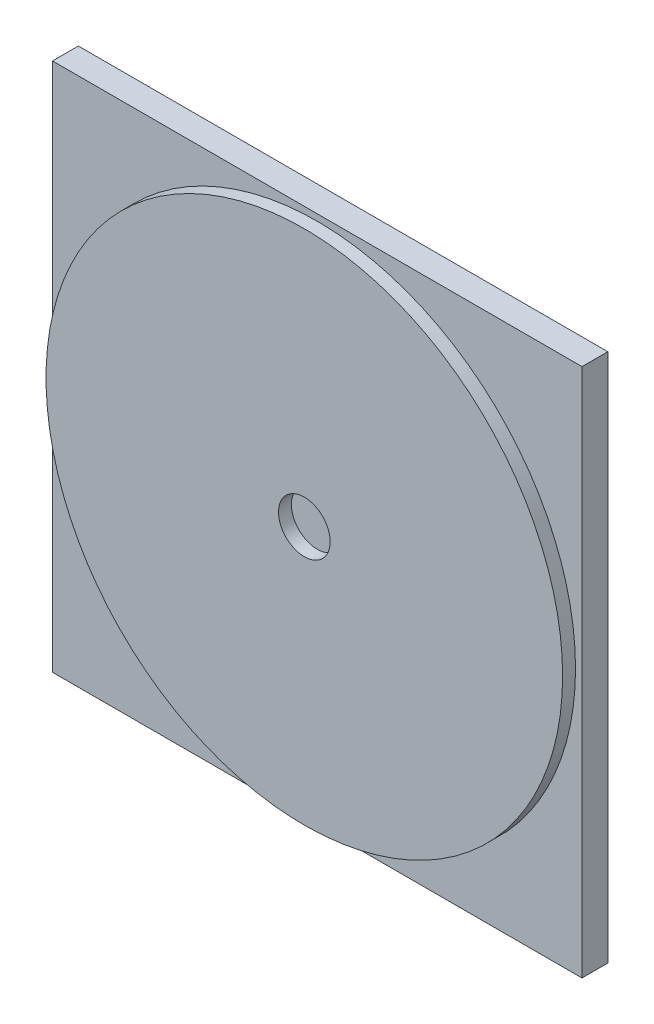
ISO-10303-21;
HEADER;
FILE_DESCRIPTION(('STEP AP214'),'2;1');
FILE_NAME('part.step','',(''),(''),'','','');
FILE_SCHEMA(('AUTOMOTIVE_DESIGN { 1 0 10303 214 1 1 1 1 }'));
ENDSEC;
DATA;
#1=APPLICATION_CONTEXT('core data for automotive mechanical design processes');
#2=APPLICATION_PROTOCOL_DEFINITION('international standard','automotive_design',2000,#1);
#3=PRODUCT_CONTEXT('',#1,'mechanical');
#4=PRODUCT('Part','Part','',(#3));
#5=PRODUCT_RELATED_PRODUCT_CATEGORY('part','',(#4));
#6=PRODUCT_DEFINITION_FORMATION('','',#4);
#7=PRODUCT_DEFINITION_CONTEXT('part definition',#1,'design');
#8=PRODUCT_DEFINITION('design','',#6,#7);
#9=PRODUCT_DEFINITION_SHAPE('','',#8);
#10=(LENGTH_UNIT() NAMED_UNIT(*) SI_UNIT(.MILLI.,.METRE.));
#11=(NAMED_UNIT(*) PLANE_ANGLE_UNIT() SI_UNIT($,.RADIAN.));
#12=(NAMED_UNIT(*) SI_UNIT($,.STERADIAN.) SOLID_ANGLE_UNIT());
#13=UNCERTAINTY_MEASURE_WITH_UNIT(LENGTH_MEASURE(1.E-05),#10,'distance_accuracy_value','');
#14=(GEOMETRIC_REPRESENTATION_CONTEXT(3) GLOBAL_UNCERTAINTY_ASSIGNED_CONTEXT((#13)) GLOBAL_UNIT_ASSIGNED_CONTEXT((#10,
#11,#12)) REPRESENTATION_CONTEXT('',''));
#15=CARTESIAN_POINT('',(0.,0.,0.));
#16=DIRECTION('',(0.,0.,1.));
#17=DIRECTION('',(1.,0.,0.));
#18=AXIS2_PLACEMENT_3D('',#15,#16,#17);
#19=CARTESIAN_POINT('',(-22.0558035714286,11.8973214285714,2.));
#20=DIRECTION('',(1.,0.,0.));
#21=DIRECTION('',(0.,0.,-1.));
#22=AXIS2_PLACEMENT_3D('',#19,#20,#21);
#23=PLANE('',#22);
#24=DIRECTION('',(0.,-1.,0.));
#25=VECTOR('',#24,1.);
#26=CARTESIAN_POINT('',(-22.0558035714286,11.8973214285714,0.));
#27=LINE('',#26,#25);
#28=CARTESIAN_POINT('',(-22.0558035714286,11.8973214285714,0.));
#29=VERTEX_POINT('',#28);
#30=CARTESIAN_POINT('',(-22.0558035714286,-29.1026785714286,0.));
#31=VERTEX_POINT('',#30);
#32=EDGE_CURVE('E99',#29,#31,#27,.T.);
#33=ORIENTED_EDGE('',*,*,#32,.T.);
#34=DIRECTION('',(0.,0.,-1.));
#35=VECTOR('',#34,1.);
#36=CARTESIAN_POINT('',(-22.0558035714286,-29.1026785714286,2.));
#37=LINE('',#36,#35);
#38=CARTESIAN_POINT('',(-22.0558035714286,-29.1026785714286,2.));
#39=VERTEX_POINT('',#38);
#40=EDGE_CURVE('E36',#39,#31,#37,.T.);
#41=ORIENTED_EDGE('',*,*,#40,.F.);
#42=DIRECTION('',(0.,-1.,0.));
#43=VECTOR('',#42,1.);
#44=CARTESIAN_POINT('',(-22.0558035714286,11.8973214285714,2.));
#45=LINE('',#44,#43);
#46=CARTESIAN_POINT('',(-22.0558035714286,11.8973214285714,2.));
#47=VERTEX_POINT('',#46);
#48=EDGE_CURVE('E86',#47,#39,#45,.T.);
#49=ORIENTED_EDGE('',*,*,#48,.F.);
#50=DIRECTION('',(0.,0.,-1.));
#51=VECTOR('',#50,1.);
#52=CARTESIAN_POINT('',(-22.0558035714286,11.8973214285714,2.));
#53=LINE('',#52,#51);
#54=EDGE_CURVE('E95',#47,#29,#53,.T.);
#55=ORIENTED_EDGE('',*,*,#54,.T.);
#56=EDGE_LOOP('',(#33,#41,#49,#55));
#57=FACE_BOUND('',#56,.T.);
#58=ADVANCED_FACE('F33',(#57),#23,.F.);
#59=CARTESIAN_POINT('',(-22.0558035714286,-29.1026785714286,2.));
#60=DIRECTION('',(0.,1.,0.));
#61=DIRECTION('',(0.,0.,1.));
#62=AXIS2_PLACEMENT_3D('',#59,#60,#61);
#63=PLANE('',#62);
#64=DIRECTION('',(1.,0.,0.));
#65=VECTOR('',#64,1.);
#66=CARTESIAN_POINT('',(-22.0558035714286,-29.1026785714286,0.));
#67=LINE('',#66,#65);
#68=CARTESIAN_POINT('',(18.9441964285714,-29.1026785714286,0.));
#69=VERTEX_POINT('',#68);
#70=EDGE_CURVE('E91',#31,#69,#67,.T.);
#71=ORIENTED_EDGE('',*,*,#70,.T.);
#72=DIRECTION('',(0.,0.,-1.));
#73=VECTOR('',#72,1.);
#74=CARTESIAN_POINT('',(18.9441964285714,-29.1026785714286,2.));
#75=LINE('',#74,#73);
#76=CARTESIAN_POINT('',(18.9441964285714,-29.1026785714286,2.));
#77=VERTEX_POINT('',#76);
#78=EDGE_CURVE('E89',#77,#69,#75,.T.);
#79=ORIENTED_EDGE('',*,*,#78,.F.);
#80=DIRECTION('',(1.,0.,0.));
#81=VECTOR('',#80,1.);
#82=CARTESIAN_POINT('',(-22.0558035714286,-29.1026785714286,2.));
#83=LINE('',#82,#81);
#84=EDGE_CURVE('E81',#39,#77,#83,.T.);
#85=ORIENTED_EDGE('',*,*,#84,.F.);
#86=ORIENTED_EDGE('',*,*,#40,.T.);
#87=EDGE_LOOP('',(#71,#79,#85,#86));
#88=FACE_BOUND('',#87,.T.);
#89=ADVANCED_FACE('F90',(#88),#63,.F.);
#90=CARTESIAN_POINT('',(18.9441964285714,11.8973214285714,2.));
#91=DIRECTION('',(-1.,0.,0.));
#92=DIRECTION('',(0.,-1.,0.));
#93=AXIS2_PLACEMENT_3D('',#90,#91,#92);
#94=PLANE('',#93);
#95=DIRECTION('',(0.,1.,0.));
#96=VECTOR('',#95,1.);
#97=CARTESIAN_POINT('',(18.9441964285714,11.8973214285714,0.));
#98=LINE('',#97,#96);
#99=CARTESIAN_POINT('',(18.9441964285714,11.8973214285714,0.));
#100=VERTEX_POINT('',#99);
#101=EDGE_CURVE('E67',#69,#100,#98,.T.);
#102=ORIENTED_EDGE('',*,*,#101,.T.);
#103=DIRECTION('',(0.,0.,-1.));
#104=VECTOR('',#103,1.);
#105=CARTESIAN_POINT('',(18.9441964285714,11.8973214285714,2.));
#106=LINE('',#105,#104);
#107=CARTESIAN_POINT('',(18.9441964285714,11.8973214285714,2.));
#108=VERTEX_POINT('',#107);
#109=EDGE_CURVE('E92',#108,#100,#106,.T.);
#110=ORIENTED_EDGE('',*,*,#109,.F.);
#111=DIRECTION('',(0.,1.,0.));
#112=VECTOR('',#111,1.);
#113=CARTESIAN_POINT('',(18.9441964285714,11.8973214285714,2.));
#114=LINE('',#113,#112);
#115=EDGE_CURVE('E84',#77,#108,#114,.T.);
#116=ORIENTED_EDGE('',*,*,#115,.F.);
#117=ORIENTED_EDGE('',*,*,#78,.T.);
#118=EDGE_LOOP('',(#102,#110,#116,#117));
#119=FACE_BOUND('',#118,.T.);
#120=ADVANCED_FACE('F93',(#119),#94,.F.);
#121=CARTESIAN_POINT('',(-22.0558035714286,11.8973214285714,2.));
#122=DIRECTION('',(0.,-1.,0.));
#123=DIRECTION('',(0.,0.,-1.));
#124=AXIS2_PLACEMENT_3D('',#121,#122,#123);
#125=PLANE('',#124);
#126=DIRECTION('',(-1.,0.,0.));
#127=VECTOR('',#126,1.);
#128=CARTESIAN_POINT('',(-22.0558035714286,11.8973214285714,0.));
#129=LINE('',#128,#127);
#130=EDGE_CURVE('E73',#100,#29,#129,.T.);
#131=ORIENTED_EDGE('',*,*,#130,.T.);
#132=ORIENTED_EDGE('',*,*,#54,.F.);
#133=DIRECTION('',(-1.,0.,0.));
#134=VECTOR('',#133,1.);
#135=CARTESIAN_POINT('',(-22.0558035714286,11.8973214285714,2.));
#136=LINE('',#135,#134);
#137=EDGE_CURVE('E50',#108,#47,#136,.T.);
#138=ORIENTED_EDGE('',*,*,#137,.F.);
#139=ORIENTED_EDGE('',*,*,#109,.T.);
#140=EDGE_LOOP('',(#131,#132,#138,#139));
#141=FACE_BOUND('',#140,.T.);
#142=ADVANCED_FACE('F107',(#141),#125,.F.);
#143=CARTESIAN_POINT('',(0.,0.,2.));
#144=DIRECTION('',(0.,0.,1.));
#145=DIRECTION('',(1.,0.,0.));
#146=AXIS2_PLACEMENT_3D('',#143,#144,#145);
#147=PLANE('',#146);
#148=CARTESIAN_POINT('',(-1.55580357142858,-8.60267857142857,2.));
#149=DIRECTION('',(0.,0.,1.));
#150=DIRECTION('',(1.,0.,0.));
#151=AXIS2_PLACEMENT_3D('',#148,#149,#150);
#152=CIRCLE('',#151,20.);
#153=CARTESIAN_POINT('',(18.4441964285714,-8.60267857142857,2.));
#154=VERTEX_POINT('',#153);
#155=EDGE_CURVE('E11',#154,#154,#152,.T.);
#156=ORIENTED_EDGE('',*,*,#155,.F.);
#157=EDGE_LOOP('',(#156));
#158=FACE_BOUND('',#157,.T.);
#159=ORIENTED_EDGE('',*,*,#48,.T.);
#160=ORIENTED_EDGE('',*,*,#84,.T.);
#161=ORIENTED_EDGE('',*,*,#115,.T.);
#162=ORIENTED_EDGE('',*,*,#137,.T.);
#163=EDGE_LOOP('',(#159,#160,#161,#162));
#164=FACE_BOUND('',#163,.T.);
#165=ADVANCED_FACE('F82',(#158,#164),#147,.T.);
#166=CARTESIAN_POINT('',(0.,0.,0.));
#167=DIRECTION('',(0.,0.,1.));
#168=DIRECTION('',(1.,0.,0.));
#169=AXIS2_PLACEMENT_3D('',#166,#167,#168);
#170=PLANE('',#169);
#171=ORIENTED_EDGE('',*,*,#32,.F.);
#172=ORIENTED_EDGE('',*,*,#130,.F.);
#173=ORIENTED_EDGE('',*,*,#101,.F.);
#174=ORIENTED_EDGE('',*,*,#70,.F.);
#175=EDGE_LOOP('',(#171,#172,#173,#174));
#176=FACE_BOUND('',#175,.T.);
#177=ADVANCED_FACE('F110',(#176),#170,.F.);
#178=CARTESIAN_POINT('',(-1.55580357142858,-8.60267857142857,3.));
#179=DIRECTION('',(0.,0.,-1.));
#180=DIRECTION('',(-1.,0.,0.));
#181=AXIS2_PLACEMENT_3D('',#178,#179,#180);
#182=CYLINDRICAL_SURFACE('',#181,20.);
#183=CARTESIAN_POINT('',(-1.55580357142858,-8.60267857142857,3.));
#184=DIRECTION('',(0.,0.,1.));
#185=DIRECTION('',(1.,0.,0.));
#186=AXIS2_PLACEMENT_3D('',#183,#184,#185);
#187=CIRCLE('',#186,20.);
#188=CARTESIAN_POINT('',(18.4441964285714,-8.60267857142857,3.));
#189=VERTEX_POINT('',#188);
#190=EDGE_CURVE('E102',#189,#189,#187,.T.);
#191=ORIENTED_EDGE('',*,*,#190,.F.);
#192=EDGE_LOOP('',(#191));
#193=FACE_BOUND('',#192,.T.);
#194=ORIENTED_EDGE('',*,*,#155,.T.);
#195=EDGE_LOOP('',(#194));
#196=FACE_BOUND('',#195,.T.);
#197=ADVANCED_FACE('F133',(#193,#196),#182,.T.);
#198=CARTESIAN_POINT('',(-1.55580357142858,-8.60267857142857,3.));
#199=DIRECTION('',(0.,0.,1.));
#200=DIRECTION('',(1.,0.,0.));
#201=AXIS2_PLACEMENT_3D('',#198,#199,#200);
#202=PLANE('',#201);
#203=CARTESIAN_POINT('',(-1.55580357142858,-8.60267857142857,3.));
#204=DIRECTION('',(0.,0.,1.));
#205=DIRECTION('',(1.,0.,0.));
#206=AXIS2_PLACEMENT_3D('',#203,#204,#205);
#207=CIRCLE('',#206,2.);
#208=CARTESIAN_POINT('',(0.444196428571417,-8.60267857142857,3.));
#209=VERTEX_POINT('',#208);
#210=EDGE_CURVE('E116',#209,#209,#207,.T.);
#211=ORIENTED_EDGE('',*,*,#210,.F.);
#212=EDGE_LOOP('',(#211));
#213=FACE_BOUND('',#212,.T.);
#214=ORIENTED_EDGE('',*,*,#190,.T.);
#215=EDGE_LOOP('',(#214));
#216=FACE_BOUND('',#215,.T.);
#217=ADVANCED_FACE('F127',(#213,#216),#202,.T.);
#218=CARTESIAN_POINT('',(-1.55580357142858,-8.60267857142857,2.));
#219=DIRECTION('',(0.,0.,1.));
#220=DIRECTION('',(1.,0.,0.));
#221=AXIS2_PLACEMENT_3D('',#218,#219,#220);
#222=CYLINDRICAL_SURFACE('',#221,2.);
#223=CARTESIAN_POINT('',(-1.55580357142858,-8.60267857142857,2.));
#224=DIRECTION('',(0.,0.,1.));
#225=DIRECTION('',(1.,0.,0.));
#226=AXIS2_PLACEMENT_3D('',#223,#224,#225);
#227=CIRCLE('',#226,2.);
#228=CARTESIAN_POINT('',(0.444196428571417,-8.60267857142857,2.));
#229=VERTEX_POINT('',#228);
#230=EDGE_CURVE('E115',#229,#229,#227,.T.);
#231=ORIENTED_EDGE('',*,*,#230,.F.);
#232=EDGE_LOOP('',(#231));
#233=FACE_BOUND('',#232,.T.);
#234=ORIENTED_EDGE('',*,*,#210,.T.);
#235=EDGE_LOOP('',(#234));
#236=FACE_BOUND('',#235,.T.);
#237=ADVANCED_FACE('F124',(#233,#236),#222,.F.);
#238=CARTESIAN_POINT('',(-1.55580357142858,-8.60267857142857,2.));
#239=DIRECTION('',(0.,0.,1.));
#240=DIRECTION('',(1.,0.,0.));
#241=AXIS2_PLACEMENT_3D('',#238,#239,#240);
#242=PLANE('',#241);
#243=ORIENTED_EDGE('',*,*,#230,.T.);
#244=EDGE_LOOP('',(#243));
#245=FACE_BOUND('',#244,.T.);
#246=ADVANCED_FACE('F122',(#245),#242,.T.);
#247=CLOSED_SHELL('',(#58,#89,#120,#142,#165,#177,#197,#217,#237,#246));
#248=MANIFOLD_SOLID_BREP('B2',#247);
#249=ADVANCED_BREP_SHAPE_REPRESENTATION('',(#18,#248),#14);
#250=SHAPE_DEFINITION_REPRESENTATION(#9,#249);
ENDSEC;
END-ISO-10303-21;
